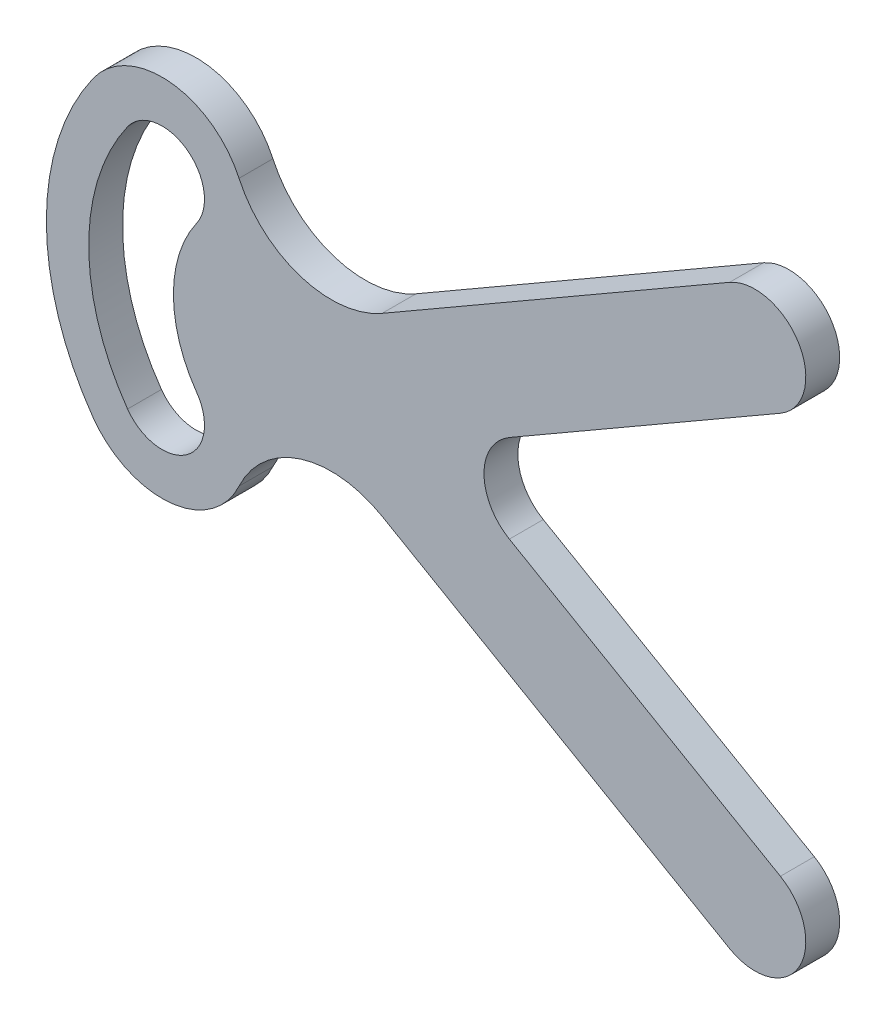
ISO-10303-21;
HEADER;
FILE_DESCRIPTION(('STEP AP214'),'2;1');
FILE_NAME('part.step','',(''),(''),'','','');
FILE_SCHEMA(('AUTOMOTIVE_DESIGN { 1 0 10303 214 1 1 1 1 }'));
ENDSEC;
DATA;
#1=APPLICATION_CONTEXT('core data for automotive mechanical design processes');
#2=APPLICATION_PROTOCOL_DEFINITION('international standard','automotive_design',2000,#1);
#3=PRODUCT_CONTEXT('',#1,'mechanical');
#4=PRODUCT('Part','Part','',(#3));
#5=PRODUCT_RELATED_PRODUCT_CATEGORY('part','',(#4));
#6=PRODUCT_DEFINITION_FORMATION('','',#4);
#7=PRODUCT_DEFINITION_CONTEXT('part definition',#1,'design');
#8=PRODUCT_DEFINITION('design','',#6,#7);
#9=PRODUCT_DEFINITION_SHAPE('','',#8);
#10=(LENGTH_UNIT() NAMED_UNIT(*) SI_UNIT(.MILLI.,.METRE.));
#11=(NAMED_UNIT(*) PLANE_ANGLE_UNIT() SI_UNIT($,.RADIAN.));
#12=(NAMED_UNIT(*) SI_UNIT($,.STERADIAN.) SOLID_ANGLE_UNIT());
#13=UNCERTAINTY_MEASURE_WITH_UNIT(LENGTH_MEASURE(1.E-05),#10,'distance_accuracy_value','');
#14=(GEOMETRIC_REPRESENTATION_CONTEXT(3) GLOBAL_UNCERTAINTY_ASSIGNED_CONTEXT((#13)) GLOBAL_UNIT_ASSIGNED_CONTEXT((#10,
#11,#12)) REPRESENTATION_CONTEXT('',''));
#15=CARTESIAN_POINT('',(0.,0.,0.));
#16=DIRECTION('',(0.,0.,1.));
#17=DIRECTION('',(1.,0.,0.));
#18=AXIS2_PLACEMENT_3D('',#15,#16,#17);
#19=CARTESIAN_POINT('',(-50.,28.8675134594814,10.));
#20=DIRECTION('',(0.,0.,1.));
#21=DIRECTION('',(1.,0.,0.));
#22=AXIS2_PLACEMENT_3D('',#19,#20,#21);
#23=PLANE('',#22);
#24=CARTESIAN_POINT('',(-50.,28.8675134594814,10.));
#25=DIRECTION('',(0.,0.,1.));
#26=DIRECTION('',(1.,0.,0.));
#27=AXIS2_PLACEMENT_3D('',#24,#25,#26);
#28=CIRCLE('',#27,25.);
#29=CARTESIAN_POINT('',(-27.3026523170337,39.347513848725,10.));
#30=VERTEX_POINT('',#29);
#31=CARTESIAN_POINT('',(-70.4124145231931,43.301270189222,10.));
#32=VERTEX_POINT('',#31);
#33=EDGE_CURVE('E185',#30,#32,#28,.T.);
#34=ORIENTED_EDGE('',*,*,#33,.T.);
#35=CARTESIAN_POINT('',(-9.17517095361376,0.,10.));
#36=DIRECTION('',(0.,0.,1.));
#37=DIRECTION('',(1.,0.,0.));
#38=AXIS2_PLACEMENT_3D('',#35,#36,#37);
#39=CIRCLE('',#38,75.);
#40=CARTESIAN_POINT('',(-70.4124145231931,-43.301270189222,10.));
#41=VERTEX_POINT('',#40);
#42=EDGE_CURVE('E188',#32,#41,#39,.T.);
#43=ORIENTED_EDGE('',*,*,#42,.T.);
#44=CARTESIAN_POINT('',(-50.,-28.8675134594814,10.));
#45=DIRECTION('',(0.,0.,1.));
#46=DIRECTION('',(-1.,0.,0.));
#47=AXIS2_PLACEMENT_3D('',#44,#45,#46);
#48=CIRCLE('',#47,25.);
#49=CARTESIAN_POINT('',(-27.3026523170337,-39.347513848725,10.));
#50=VERTEX_POINT('',#49);
#51=EDGE_CURVE('E191',#41,#50,#48,.T.);
#52=ORIENTED_EDGE('',*,*,#51,.T.);
#53=CARTESIAN_POINT('',(-0.0658350974742106,-51.9235143158173,10.));
#54=DIRECTION('',(0.,0.,-1.));
#55=DIRECTION('',(1.,0.,0.));
#56=AXIS2_PLACEMENT_3D('',#53,#54,#55);
#57=CIRCLE('',#56,30.);
#58=CARTESIAN_POINT('',(14.9341649025256,-25.942752202284,10.));
#59=VERTEX_POINT('',#58);
#60=EDGE_CURVE('E193',#50,#59,#57,.T.);
#61=ORIENTED_EDGE('',*,*,#60,.T.);
#62=DIRECTION('',(0.866025403784442,-0.499999999999995,0.));
#63=VECTOR('',#62,1.);
#64=CARTESIAN_POINT('',(117.5,-85.1591647054689,10.));
#65=LINE('',#64,#63);
#66=CARTESIAN_POINT('',(117.5,-85.1591647054689,10.));
#67=VERTEX_POINT('',#66);
#68=EDGE_CURVE('E195',#59,#67,#65,.T.);
#69=ORIENTED_EDGE('',*,*,#68,.T.);
#70=CARTESIAN_POINT('',(125.,-72.1687836487022,10.));
#71=DIRECTION('',(0.,0.,1.));
#72=DIRECTION('',(-1.,0.,0.));
#73=AXIS2_PLACEMENT_3D('',#70,#71,#72);
#74=CIRCLE('',#73,15.);
#75=CARTESIAN_POINT('',(132.5,-59.1784025919356,10.));
#76=VERTEX_POINT('',#75);
#77=EDGE_CURVE('E197',#67,#76,#74,.T.);
#78=ORIENTED_EDGE('',*,*,#77,.T.);
#79=DIRECTION('',(-0.866025403784441,0.499999999999995,0.));
#80=VECTOR('',#79,1.);
#81=CARTESIAN_POINT('',(132.5,-59.1784025919356,10.));
#82=LINE('',#81,#80);
#83=CARTESIAN_POINT('',(52.5000000000007,-12.9903810567666,10.));
#84=VERTEX_POINT('',#83);
#85=EDGE_CURVE('E199',#76,#84,#82,.T.);
#86=ORIENTED_EDGE('',*,*,#85,.T.);
#87=CARTESIAN_POINT('',(60.0000000000006,0.,10.));
#88=DIRECTION('',(0.,0.,-1.));
#89=DIRECTION('',(1.,0.,0.));
#90=AXIS2_PLACEMENT_3D('',#87,#88,#89);
#91=CIRCLE('',#90,15.);
#92=CARTESIAN_POINT('',(52.5000000000009,12.9903810567667,10.));
#93=VERTEX_POINT('',#92);
#94=EDGE_CURVE('E201',#84,#93,#91,.T.);
#95=ORIENTED_EDGE('',*,*,#94,.T.);
#96=DIRECTION('',(0.866025403784441,0.499999999999995,0.));
#97=VECTOR('',#96,1.);
#98=CARTESIAN_POINT('',(132.5,59.1784025919356,10.));
#99=LINE('',#98,#97);
#100=CARTESIAN_POINT('',(132.5,59.1784025919356,10.));
#101=VERTEX_POINT('',#100);
#102=EDGE_CURVE('E203',#93,#101,#99,.T.);
#103=ORIENTED_EDGE('',*,*,#102,.T.);
#104=CARTESIAN_POINT('',(125.,72.1687836487023,10.));
#105=DIRECTION('',(0.,0.,1.));
#106=DIRECTION('',(1.,0.,0.));
#107=AXIS2_PLACEMENT_3D('',#104,#105,#106);
#108=CIRCLE('',#107,15.);
#109=CARTESIAN_POINT('',(117.5,85.1591647054689,10.));
#110=VERTEX_POINT('',#109);
#111=EDGE_CURVE('E205',#101,#110,#108,.T.);
#112=ORIENTED_EDGE('',*,*,#111,.T.);
#113=DIRECTION('',(-0.866025403784441,-0.499999999999995,0.));
#114=VECTOR('',#113,1.);
#115=CARTESIAN_POINT('',(117.5,85.1591647054689,10.));
#116=LINE('',#115,#114);
#117=CARTESIAN_POINT('',(14.9341649025256,25.942752202284,10.));
#118=VERTEX_POINT('',#117);
#119=EDGE_CURVE('E207',#110,#118,#116,.T.);
#120=ORIENTED_EDGE('',*,*,#119,.T.);
#121=CARTESIAN_POINT('',(-0.0658350974742233,51.9235143158173,10.));
#122=DIRECTION('',(0.,0.,-1.));
#123=DIRECTION('',(-1.,0.,0.));
#124=AXIS2_PLACEMENT_3D('',#121,#122,#123);
#125=CIRCLE('',#124,30.);
#126=EDGE_CURVE('E209',#118,#30,#125,.T.);
#127=ORIENTED_EDGE('',*,*,#126,.T.);
#128=EDGE_LOOP('',(#34,#43,#52,#61,#69,#78,#86,#95,#103,#112,#120,#127));
#129=FACE_BOUND('',#128,.T.);
#130=CARTESIAN_POINT('',(-9.17517095361372,0.,10.));
#131=DIRECTION('',(0.,0.,1.));
#132=DIRECTION('',(1.,0.,0.));
#133=AXIS2_PLACEMENT_3D('',#130,#131,#132);
#134=CIRCLE('',#133,62.5);
#135=CARTESIAN_POINT('',(-60.2062072615966,36.0843918243517,10.));
#136=VERTEX_POINT('',#135);
#137=CARTESIAN_POINT('',(-60.2062072615966,-36.0843918243517,10.));
#138=VERTEX_POINT('',#137);
#139=EDGE_CURVE('E157',#136,#138,#134,.T.);
#140=ORIENTED_EDGE('',*,*,#139,.F.);
#141=CARTESIAN_POINT('',(-50.,28.8675134594814,10.));
#142=DIRECTION('',(0.,0.,1.));
#143=DIRECTION('',(1.,0.,0.));
#144=AXIS2_PLACEMENT_3D('',#141,#142,#143);
#145=CIRCLE('',#144,12.5);
#146=CARTESIAN_POINT('',(-39.7937927384034,21.650635094611,10.));
#147=VERTEX_POINT('',#146);
#148=EDGE_CURVE('E149',#147,#136,#145,.T.);
#149=ORIENTED_EDGE('',*,*,#148,.F.);
#150=CARTESIAN_POINT('',(-9.17517095361372,0.,10.));
#151=DIRECTION('',(0.,0.,-1.));
#152=DIRECTION('',(1.,0.,0.));
#153=AXIS2_PLACEMENT_3D('',#150,#151,#152);
#154=CIRCLE('',#153,37.5);
#155=CARTESIAN_POINT('',(-39.7937927384034,-21.650635094611,10.));
#156=VERTEX_POINT('',#155);
#157=EDGE_CURVE('E171',#156,#147,#154,.T.);
#158=ORIENTED_EDGE('',*,*,#157,.F.);
#159=CARTESIAN_POINT('',(-50.,-28.8675134594814,10.));
#160=DIRECTION('',(0.,0.,1.));
#161=DIRECTION('',(1.,0.,0.));
#162=AXIS2_PLACEMENT_3D('',#159,#160,#161);
#163=CIRCLE('',#162,12.5);
#164=EDGE_CURVE('E169',#138,#156,#163,.T.);
#165=ORIENTED_EDGE('',*,*,#164,.F.);
#166=EDGE_LOOP('',(#140,#149,#158,#165));
#167=FACE_BOUND('',#166,.T.);
#168=ADVANCED_FACE('F36',(#129,#167),#23,.T.);
#169=CARTESIAN_POINT('',(-50.,28.8675134594814,0.));
#170=DIRECTION('',(0.,0.,1.));
#171=DIRECTION('',(1.,0.,0.));
#172=AXIS2_PLACEMENT_3D('',#169,#170,#171);
#173=PLANE('',#172);
#174=CARTESIAN_POINT('',(-50.,28.8675134594814,0.));
#175=DIRECTION('',(0.,0.,1.));
#176=DIRECTION('',(1.,0.,0.));
#177=AXIS2_PLACEMENT_3D('',#174,#175,#176);
#178=CIRCLE('',#177,25.);
#179=CARTESIAN_POINT('',(-27.3026523170337,39.347513848725,0.));
#180=VERTEX_POINT('',#179);
#181=CARTESIAN_POINT('',(-70.4124145231931,43.301270189222,0.));
#182=VERTEX_POINT('',#181);
#183=EDGE_CURVE('E165',#180,#182,#178,.T.);
#184=ORIENTED_EDGE('',*,*,#183,.F.);
#185=CARTESIAN_POINT('',(-0.0658350974742233,51.9235143158173,0.));
#186=DIRECTION('',(0.,0.,-1.));
#187=DIRECTION('',(-1.,0.,0.));
#188=AXIS2_PLACEMENT_3D('',#185,#186,#187);
#189=CIRCLE('',#188,30.);
#190=CARTESIAN_POINT('',(14.9341649025256,25.942752202284,0.));
#191=VERTEX_POINT('',#190);
#192=EDGE_CURVE('E189',#191,#180,#189,.T.);
#193=ORIENTED_EDGE('',*,*,#192,.F.);
#194=DIRECTION('',(-0.866025403784441,-0.499999999999995,0.));
#195=VECTOR('',#194,1.);
#196=CARTESIAN_POINT('',(117.5,85.1591647054689,0.));
#197=LINE('',#196,#195);
#198=CARTESIAN_POINT('',(117.5,85.1591647054689,0.));
#199=VERTEX_POINT('',#198);
#200=EDGE_CURVE('E232',#199,#191,#197,.T.);
#201=ORIENTED_EDGE('',*,*,#200,.F.);
#202=CARTESIAN_POINT('',(125.,72.1687836487023,0.));
#203=DIRECTION('',(0.,0.,1.));
#204=DIRECTION('',(1.,0.,0.));
#205=AXIS2_PLACEMENT_3D('',#202,#203,#204);
#206=CIRCLE('',#205,15.);
#207=CARTESIAN_POINT('',(132.5,59.1784025919356,0.));
#208=VERTEX_POINT('',#207);
#209=EDGE_CURVE('E230',#208,#199,#206,.T.);
#210=ORIENTED_EDGE('',*,*,#209,.F.);
#211=DIRECTION('',(0.866025403784441,0.499999999999995,0.));
#212=VECTOR('',#211,1.);
#213=CARTESIAN_POINT('',(132.5,59.1784025919356,0.));
#214=LINE('',#213,#212);
#215=CARTESIAN_POINT('',(52.5000000000009,12.9903810567667,0.));
#216=VERTEX_POINT('',#215);
#217=EDGE_CURVE('E228',#216,#208,#214,.T.);
#218=ORIENTED_EDGE('',*,*,#217,.F.);
#219=CARTESIAN_POINT('',(60.0000000000006,0.,0.));
#220=DIRECTION('',(0.,0.,-1.));
#221=DIRECTION('',(1.,0.,0.));
#222=AXIS2_PLACEMENT_3D('',#219,#220,#221);
#223=CIRCLE('',#222,15.);
#224=CARTESIAN_POINT('',(52.5000000000007,-12.9903810567666,0.));
#225=VERTEX_POINT('',#224);
#226=EDGE_CURVE('E226',#225,#216,#223,.T.);
#227=ORIENTED_EDGE('',*,*,#226,.F.);
#228=DIRECTION('',(-0.866025403784441,0.499999999999995,0.));
#229=VECTOR('',#228,1.);
#230=CARTESIAN_POINT('',(132.5,-59.1784025919356,0.));
#231=LINE('',#230,#229);
#232=CARTESIAN_POINT('',(132.5,-59.1784025919356,0.));
#233=VERTEX_POINT('',#232);
#234=EDGE_CURVE('E224',#233,#225,#231,.T.);
#235=ORIENTED_EDGE('',*,*,#234,.F.);
#236=CARTESIAN_POINT('',(125.,-72.1687836487022,0.));
#237=DIRECTION('',(0.,0.,1.));
#238=DIRECTION('',(-1.,0.,0.));
#239=AXIS2_PLACEMENT_3D('',#236,#237,#238);
#240=CIRCLE('',#239,15.);
#241=CARTESIAN_POINT('',(117.5,-85.1591647054689,0.));
#242=VERTEX_POINT('',#241);
#243=EDGE_CURVE('E222',#242,#233,#240,.T.);
#244=ORIENTED_EDGE('',*,*,#243,.F.);
#245=DIRECTION('',(0.866025403784442,-0.499999999999995,0.));
#246=VECTOR('',#245,1.);
#247=CARTESIAN_POINT('',(117.5,-85.1591647054689,0.));
#248=LINE('',#247,#246);
#249=CARTESIAN_POINT('',(14.9341649025256,-25.942752202284,0.));
#250=VERTEX_POINT('',#249);
#251=EDGE_CURVE('E220',#250,#242,#248,.T.);
#252=ORIENTED_EDGE('',*,*,#251,.F.);
#253=CARTESIAN_POINT('',(-0.0658350974742106,-51.9235143158173,0.));
#254=DIRECTION('',(0.,0.,-1.));
#255=DIRECTION('',(1.,0.,0.));
#256=AXIS2_PLACEMENT_3D('',#253,#254,#255);
#257=CIRCLE('',#256,30.);
#258=CARTESIAN_POINT('',(-27.3026523170337,-39.347513848725,0.));
#259=VERTEX_POINT('',#258);
#260=EDGE_CURVE('E218',#259,#250,#257,.T.);
#261=ORIENTED_EDGE('',*,*,#260,.F.);
#262=CARTESIAN_POINT('',(-50.,-28.8675134594814,0.));
#263=DIRECTION('',(0.,0.,1.));
#264=DIRECTION('',(-1.,0.,0.));
#265=AXIS2_PLACEMENT_3D('',#262,#263,#264);
#266=CIRCLE('',#265,25.);
#267=CARTESIAN_POINT('',(-70.4124145231931,-43.301270189222,0.));
#268=VERTEX_POINT('',#267);
#269=EDGE_CURVE('E216',#268,#259,#266,.T.);
#270=ORIENTED_EDGE('',*,*,#269,.F.);
#271=CARTESIAN_POINT('',(-9.17517095361376,0.,0.));
#272=DIRECTION('',(0.,0.,1.));
#273=DIRECTION('',(1.,0.,0.));
#274=AXIS2_PLACEMENT_3D('',#271,#272,#273);
#275=CIRCLE('',#274,75.);
#276=EDGE_CURVE('E214',#182,#268,#275,.T.);
#277=ORIENTED_EDGE('',*,*,#276,.F.);
#278=EDGE_LOOP('',(#184,#193,#201,#210,#218,#227,#235,#244,#252,#261,#270,#277));
#279=FACE_BOUND('',#278,.T.);
#280=CARTESIAN_POINT('',(-50.,28.8675134594814,0.));
#281=DIRECTION('',(0.,0.,1.));
#282=DIRECTION('',(1.,0.,0.));
#283=AXIS2_PLACEMENT_3D('',#280,#281,#282);
#284=CIRCLE('',#283,12.5);
#285=CARTESIAN_POINT('',(-39.7937927384034,21.650635094611,0.));
#286=VERTEX_POINT('',#285);
#287=CARTESIAN_POINT('',(-60.2062072615966,36.0843918243517,0.));
#288=VERTEX_POINT('',#287);
#289=EDGE_CURVE('E59',#286,#288,#284,.T.);
#290=ORIENTED_EDGE('',*,*,#289,.T.);
#291=CARTESIAN_POINT('',(-9.17517095361372,0.,0.));
#292=DIRECTION('',(0.,0.,1.));
#293=DIRECTION('',(1.,0.,0.));
#294=AXIS2_PLACEMENT_3D('',#291,#292,#293);
#295=CIRCLE('',#294,62.5);
#296=CARTESIAN_POINT('',(-60.2062072615966,-36.0843918243517,0.));
#297=VERTEX_POINT('',#296);
#298=EDGE_CURVE('E164',#288,#297,#295,.T.);
#299=ORIENTED_EDGE('',*,*,#298,.T.);
#300=CARTESIAN_POINT('',(-50.,-28.8675134594814,0.));
#301=DIRECTION('',(0.,0.,1.));
#302=DIRECTION('',(1.,0.,0.));
#303=AXIS2_PLACEMENT_3D('',#300,#301,#302);
#304=CIRCLE('',#303,12.5);
#305=CARTESIAN_POINT('',(-39.7937927384034,-21.650635094611,0.));
#306=VERTEX_POINT('',#305);
#307=EDGE_CURVE('E177',#297,#306,#304,.T.);
#308=ORIENTED_EDGE('',*,*,#307,.T.);
#309=CARTESIAN_POINT('',(-9.17517095361372,0.,0.));
#310=DIRECTION('',(0.,0.,-1.));
#311=DIRECTION('',(1.,0.,0.));
#312=AXIS2_PLACEMENT_3D('',#309,#310,#311);
#313=CIRCLE('',#312,37.5);
#314=EDGE_CURVE('E158',#306,#286,#313,.T.);
#315=ORIENTED_EDGE('',*,*,#314,.T.);
#316=EDGE_LOOP('',(#290,#299,#308,#315));
#317=FACE_BOUND('',#316,.T.);
#318=ADVANCED_FACE('F274',(#279,#317),#173,.F.);
#319=CARTESIAN_POINT('',(-50.,28.8675134594814,10.));
#320=DIRECTION('',(0.,0.,-1.));
#321=DIRECTION('',(-1.,0.,0.));
#322=AXIS2_PLACEMENT_3D('',#319,#320,#321);
#323=CYLINDRICAL_SURFACE('',#322,25.);
#324=ORIENTED_EDGE('',*,*,#183,.T.);
#325=DIRECTION('',(0.,0.,-1.));
#326=VECTOR('',#325,1.);
#327=CARTESIAN_POINT('',(-70.4124145231931,43.301270189222,10.));
#328=LINE('',#327,#326);
#329=EDGE_CURVE('E11',#32,#182,#328,.T.);
#330=ORIENTED_EDGE('',*,*,#329,.F.);
#331=ORIENTED_EDGE('',*,*,#33,.F.);
#332=DIRECTION('',(0.,0.,-1.));
#333=VECTOR('',#332,1.);
#334=CARTESIAN_POINT('',(-27.3026523170337,39.347513848725,10.));
#335=LINE('',#334,#333);
#336=EDGE_CURVE('E211',#30,#180,#335,.T.);
#337=ORIENTED_EDGE('',*,*,#336,.T.);
#338=EDGE_LOOP('',(#324,#330,#331,#337));
#339=FACE_BOUND('',#338,.T.);
#340=ADVANCED_FACE('F38',(#339),#323,.T.);
#341=CARTESIAN_POINT('',(-9.17517095361376,0.,10.));
#342=DIRECTION('',(0.,0.,-1.));
#343=DIRECTION('',(-1.,0.,0.));
#344=AXIS2_PLACEMENT_3D('',#341,#342,#343);
#345=CYLINDRICAL_SURFACE('',#344,75.);
#346=ORIENTED_EDGE('',*,*,#276,.T.);
#347=DIRECTION('',(0.,0.,-1.));
#348=VECTOR('',#347,1.);
#349=CARTESIAN_POINT('',(-70.4124145231931,-43.301270189222,10.));
#350=LINE('',#349,#348);
#351=EDGE_CURVE('E44',#41,#268,#350,.T.);
#352=ORIENTED_EDGE('',*,*,#351,.F.);
#353=ORIENTED_EDGE('',*,*,#42,.F.);
#354=ORIENTED_EDGE('',*,*,#329,.T.);
#355=EDGE_LOOP('',(#346,#352,#353,#354));
#356=FACE_BOUND('',#355,.T.);
#357=ADVANCED_FACE('F291',(#356),#345,.T.);
#358=CARTESIAN_POINT('',(-50.,-28.8675134594814,10.));
#359=DIRECTION('',(0.,0.,-1.));
#360=DIRECTION('',(-1.,0.,0.));
#361=AXIS2_PLACEMENT_3D('',#358,#359,#360);
#362=CYLINDRICAL_SURFACE('',#361,25.);
#363=ORIENTED_EDGE('',*,*,#269,.T.);
#364=DIRECTION('',(0.,0.,-1.));
#365=VECTOR('',#364,1.);
#366=CARTESIAN_POINT('',(-27.3026523170337,-39.347513848725,10.));
#367=LINE('',#366,#365);
#368=EDGE_CURVE('E261',#50,#259,#367,.T.);
#369=ORIENTED_EDGE('',*,*,#368,.F.);
#370=ORIENTED_EDGE('',*,*,#51,.F.);
#371=ORIENTED_EDGE('',*,*,#351,.T.);
#372=EDGE_LOOP('',(#363,#369,#370,#371));
#373=FACE_BOUND('',#372,.T.);
#374=ADVANCED_FACE('F268',(#373),#362,.T.);
#375=CARTESIAN_POINT('',(-0.0658350974742106,-51.9235143158173,10.));
#376=DIRECTION('',(0.,0.,-1.));
#377=DIRECTION('',(-1.,0.,0.));
#378=AXIS2_PLACEMENT_3D('',#375,#376,#377);
#379=CYLINDRICAL_SURFACE('',#378,30.);
#380=ORIENTED_EDGE('',*,*,#260,.T.);
#381=DIRECTION('',(0.,0.,-1.));
#382=VECTOR('',#381,1.);
#383=CARTESIAN_POINT('',(14.9341649025256,-25.942752202284,10.));
#384=LINE('',#383,#382);
#385=EDGE_CURVE('E258',#59,#250,#384,.T.);
#386=ORIENTED_EDGE('',*,*,#385,.F.);
#387=ORIENTED_EDGE('',*,*,#60,.F.);
#388=ORIENTED_EDGE('',*,*,#368,.T.);
#389=EDGE_LOOP('',(#380,#386,#387,#388));
#390=FACE_BOUND('',#389,.T.);
#391=ADVANCED_FACE('F280',(#390),#379,.F.);
#392=CARTESIAN_POINT('',(117.5,-85.1591647054689,10.));
#393=DIRECTION('',(0.499999999999995,0.866025403784442,0.));
#394=DIRECTION('',(-0.866025403784442,0.499999999999995,0.));
#395=AXIS2_PLACEMENT_3D('',#392,#393,#394);
#396=PLANE('',#395);
#397=ORIENTED_EDGE('',*,*,#251,.T.);
#398=DIRECTION('',(0.,0.,-1.));
#399=VECTOR('',#398,1.);
#400=CARTESIAN_POINT('',(117.5,-85.1591647054689,10.));
#401=LINE('',#400,#399);
#402=EDGE_CURVE('E255',#67,#242,#401,.T.);
#403=ORIENTED_EDGE('',*,*,#402,.F.);
#404=ORIENTED_EDGE('',*,*,#68,.F.);
#405=ORIENTED_EDGE('',*,*,#385,.T.);
#406=EDGE_LOOP('',(#397,#403,#404,#405));
#407=FACE_BOUND('',#406,.T.);
#408=ADVANCED_FACE('F284',(#407),#396,.F.);
#409=CARTESIAN_POINT('',(125.,-72.1687836487022,10.));
#410=DIRECTION('',(0.,0.,-1.));
#411=DIRECTION('',(-1.,0.,0.));
#412=AXIS2_PLACEMENT_3D('',#409,#410,#411);
#413=CYLINDRICAL_SURFACE('',#412,15.);
#414=ORIENTED_EDGE('',*,*,#243,.T.);
#415=DIRECTION('',(0.,0.,-1.));
#416=VECTOR('',#415,1.);
#417=CARTESIAN_POINT('',(132.5,-59.1784025919356,10.));
#418=LINE('',#417,#416);
#419=EDGE_CURVE('E252',#76,#233,#418,.T.);
#420=ORIENTED_EDGE('',*,*,#419,.F.);
#421=ORIENTED_EDGE('',*,*,#77,.F.);
#422=ORIENTED_EDGE('',*,*,#402,.T.);
#423=EDGE_LOOP('',(#414,#420,#421,#422));
#424=FACE_BOUND('',#423,.T.);
#425=ADVANCED_FACE('F324',(#424),#413,.T.);
#426=CARTESIAN_POINT('',(132.5,-59.1784025919356,10.));
#427=DIRECTION('',(-0.499999999999995,-0.866025403784442,0.));
#428=DIRECTION('',(0.866025403784442,-0.499999999999995,0.));
#429=AXIS2_PLACEMENT_3D('',#426,#427,#428);
#430=PLANE('',#429);
#431=ORIENTED_EDGE('',*,*,#234,.T.);
#432=DIRECTION('',(0.,0.,-1.));
#433=VECTOR('',#432,1.);
#434=CARTESIAN_POINT('',(52.5000000000007,-12.9903810567666,10.));
#435=LINE('',#434,#433);
#436=EDGE_CURVE('E249',#84,#225,#435,.T.);
#437=ORIENTED_EDGE('',*,*,#436,.F.);
#438=ORIENTED_EDGE('',*,*,#85,.F.);
#439=ORIENTED_EDGE('',*,*,#419,.T.);
#440=EDGE_LOOP('',(#431,#437,#438,#439));
#441=FACE_BOUND('',#440,.T.);
#442=ADVANCED_FACE('F322',(#441),#430,.F.);
#443=CARTESIAN_POINT('',(60.0000000000006,0.,10.));
#444=DIRECTION('',(0.,0.,-1.));
#445=DIRECTION('',(-1.,0.,0.));
#446=AXIS2_PLACEMENT_3D('',#443,#444,#445);
#447=CYLINDRICAL_SURFACE('',#446,15.);
#448=ORIENTED_EDGE('',*,*,#226,.T.);
#449=DIRECTION('',(0.,0.,-1.));
#450=VECTOR('',#449,1.);
#451=CARTESIAN_POINT('',(52.5000000000009,12.9903810567667,10.));
#452=LINE('',#451,#450);
#453=EDGE_CURVE('E246',#93,#216,#452,.T.);
#454=ORIENTED_EDGE('',*,*,#453,.F.);
#455=ORIENTED_EDGE('',*,*,#94,.F.);
#456=ORIENTED_EDGE('',*,*,#436,.T.);
#457=EDGE_LOOP('',(#448,#454,#455,#456));
#458=FACE_BOUND('',#457,.T.);
#459=ADVANCED_FACE('F318',(#458),#447,.F.);
#460=CARTESIAN_POINT('',(132.5,59.1784025919356,10.));
#461=DIRECTION('',(-0.499999999999995,0.866025403784441,0.));
#462=DIRECTION('',(-0.866025403784441,-0.499999999999995,0.));
#463=AXIS2_PLACEMENT_3D('',#460,#461,#462);
#464=PLANE('',#463);
#465=ORIENTED_EDGE('',*,*,#217,.T.);
#466=DIRECTION('',(0.,0.,-1.));
#467=VECTOR('',#466,1.);
#468=CARTESIAN_POINT('',(132.5,59.1784025919356,10.));
#469=LINE('',#468,#467);
#470=EDGE_CURVE('E243',#101,#208,#469,.T.);
#471=ORIENTED_EDGE('',*,*,#470,.F.);
#472=ORIENTED_EDGE('',*,*,#102,.F.);
#473=ORIENTED_EDGE('',*,*,#453,.T.);
#474=EDGE_LOOP('',(#465,#471,#472,#473));
#475=FACE_BOUND('',#474,.T.);
#476=ADVANCED_FACE('F313',(#475),#464,.F.);
#477=CARTESIAN_POINT('',(125.,72.1687836487023,10.));
#478=DIRECTION('',(0.,0.,-1.));
#479=DIRECTION('',(-1.,0.,0.));
#480=AXIS2_PLACEMENT_3D('',#477,#478,#479);
#481=CYLINDRICAL_SURFACE('',#480,15.);
#482=ORIENTED_EDGE('',*,*,#209,.T.);
#483=DIRECTION('',(0.,0.,-1.));
#484=VECTOR('',#483,1.);
#485=CARTESIAN_POINT('',(117.5,85.1591647054689,10.));
#486=LINE('',#485,#484);
#487=EDGE_CURVE('E240',#110,#199,#486,.T.);
#488=ORIENTED_EDGE('',*,*,#487,.F.);
#489=ORIENTED_EDGE('',*,*,#111,.F.);
#490=ORIENTED_EDGE('',*,*,#470,.T.);
#491=EDGE_LOOP('',(#482,#488,#489,#490));
#492=FACE_BOUND('',#491,.T.);
#493=ADVANCED_FACE('F307',(#492),#481,.T.);
#494=CARTESIAN_POINT('',(117.5,85.1591647054689,10.));
#495=DIRECTION('',(0.499999999999995,-0.866025403784441,0.));
#496=DIRECTION('',(0.866025403784441,0.499999999999995,0.));
#497=AXIS2_PLACEMENT_3D('',#494,#495,#496);
#498=PLANE('',#497);
#499=ORIENTED_EDGE('',*,*,#200,.T.);
#500=DIRECTION('',(0.,0.,-1.));
#501=VECTOR('',#500,1.);
#502=CARTESIAN_POINT('',(14.9341649025256,25.942752202284,10.));
#503=LINE('',#502,#501);
#504=EDGE_CURVE('E237',#118,#191,#503,.T.);
#505=ORIENTED_EDGE('',*,*,#504,.F.);
#506=ORIENTED_EDGE('',*,*,#119,.F.);
#507=ORIENTED_EDGE('',*,*,#487,.T.);
#508=EDGE_LOOP('',(#499,#505,#506,#507));
#509=FACE_BOUND('',#508,.T.);
#510=ADVANCED_FACE('F303',(#509),#498,.F.);
#511=CARTESIAN_POINT('',(-0.0658350974742233,51.9235143158173,10.));
#512=DIRECTION('',(0.,0.,-1.));
#513=DIRECTION('',(-1.,0.,0.));
#514=AXIS2_PLACEMENT_3D('',#511,#512,#513);
#515=CYLINDRICAL_SURFACE('',#514,30.);
#516=ORIENTED_EDGE('',*,*,#192,.T.);
#517=ORIENTED_EDGE('',*,*,#336,.F.);
#518=ORIENTED_EDGE('',*,*,#126,.F.);
#519=ORIENTED_EDGE('',*,*,#504,.T.);
#520=EDGE_LOOP('',(#516,#517,#518,#519));
#521=FACE_BOUND('',#520,.T.);
#522=ADVANCED_FACE('F298',(#521),#515,.F.);
#523=CARTESIAN_POINT('',(-50.,28.8675134594814,10.));
#524=DIRECTION('',(0.,0.,-1.));
#525=DIRECTION('',(-1.,0.,0.));
#526=AXIS2_PLACEMENT_3D('',#523,#524,#525);
#527=CYLINDRICAL_SURFACE('',#526,12.5);
#528=ORIENTED_EDGE('',*,*,#289,.F.);
#529=DIRECTION('',(0.,0.,-1.));
#530=VECTOR('',#529,1.);
#531=CARTESIAN_POINT('',(-39.7937927384034,21.650635094611,10.));
#532=LINE('',#531,#530);
#533=EDGE_CURVE('E153',#147,#286,#532,.T.);
#534=ORIENTED_EDGE('',*,*,#533,.F.);
#535=ORIENTED_EDGE('',*,*,#148,.T.);
#536=DIRECTION('',(0.,0.,-1.));
#537=VECTOR('',#536,1.);
#538=CARTESIAN_POINT('',(-60.2062072615966,36.0843918243517,10.));
#539=LINE('',#538,#537);
#540=EDGE_CURVE('E152',#136,#288,#539,.T.);
#541=ORIENTED_EDGE('',*,*,#540,.T.);
#542=EDGE_LOOP('',(#528,#534,#535,#541));
#543=FACE_BOUND('',#542,.T.);
#544=ADVANCED_FACE('F151',(#543),#527,.F.);
#545=CARTESIAN_POINT('',(-9.17517095361372,0.,10.));
#546=DIRECTION('',(0.,0.,-1.));
#547=DIRECTION('',(-1.,0.,0.));
#548=AXIS2_PLACEMENT_3D('',#545,#546,#547);
#549=CYLINDRICAL_SURFACE('',#548,62.5);
#550=ORIENTED_EDGE('',*,*,#298,.F.);
#551=ORIENTED_EDGE('',*,*,#540,.F.);
#552=ORIENTED_EDGE('',*,*,#139,.T.);
#553=DIRECTION('',(0.,0.,-1.));
#554=VECTOR('',#553,1.);
#555=CARTESIAN_POINT('',(-60.2062072615966,-36.0843918243517,10.));
#556=LINE('',#555,#554);
#557=EDGE_CURVE('E166',#138,#297,#556,.T.);
#558=ORIENTED_EDGE('',*,*,#557,.T.);
#559=EDGE_LOOP('',(#550,#551,#552,#558));
#560=FACE_BOUND('',#559,.T.);
#561=ADVANCED_FACE('F161',(#560),#549,.F.);
#562=CARTESIAN_POINT('',(-50.,-28.8675134594814,10.));
#563=DIRECTION('',(0.,0.,-1.));
#564=DIRECTION('',(-1.,0.,0.));
#565=AXIS2_PLACEMENT_3D('',#562,#563,#564);
#566=CYLINDRICAL_SURFACE('',#565,12.5);
#567=ORIENTED_EDGE('',*,*,#307,.F.);
#568=ORIENTED_EDGE('',*,*,#557,.F.);
#569=ORIENTED_EDGE('',*,*,#164,.T.);
#570=DIRECTION('',(0.,0.,-1.));
#571=VECTOR('',#570,1.);
#572=CARTESIAN_POINT('',(-39.7937927384034,-21.650635094611,10.));
#573=LINE('',#572,#571);
#574=EDGE_CURVE('E51',#156,#306,#573,.T.);
#575=ORIENTED_EDGE('',*,*,#574,.T.);
#576=EDGE_LOOP('',(#567,#568,#569,#575));
#577=FACE_BOUND('',#576,.T.);
#578=ADVANCED_FACE('F382',(#577),#566,.F.);
#579=CARTESIAN_POINT('',(-9.17517095361372,0.,10.));
#580=DIRECTION('',(0.,0.,-1.));
#581=DIRECTION('',(-1.,0.,0.));
#582=AXIS2_PLACEMENT_3D('',#579,#580,#581);
#583=CYLINDRICAL_SURFACE('',#582,37.5);
#584=ORIENTED_EDGE('',*,*,#314,.F.);
#585=ORIENTED_EDGE('',*,*,#574,.F.);
#586=ORIENTED_EDGE('',*,*,#157,.T.);
#587=ORIENTED_EDGE('',*,*,#533,.T.);
#588=EDGE_LOOP('',(#584,#585,#586,#587));
#589=FACE_BOUND('',#588,.T.);
#590=ADVANCED_FACE('F388',(#589),#583,.T.);
#591=CLOSED_SHELL('',(#168,#318,#340,#357,#374,#391,#408,#425,#442,#459,#476,#493,#510,#522,
#544,#561,#578,#590));
#592=MANIFOLD_SOLID_BREP('B2',#591);
#593=ADVANCED_BREP_SHAPE_REPRESENTATION('',(#18,#592),#14);
#594=SHAPE_DEFINITION_REPRESENTATION(#9,#593);
ENDSEC;
END-ISO-10303-21;
